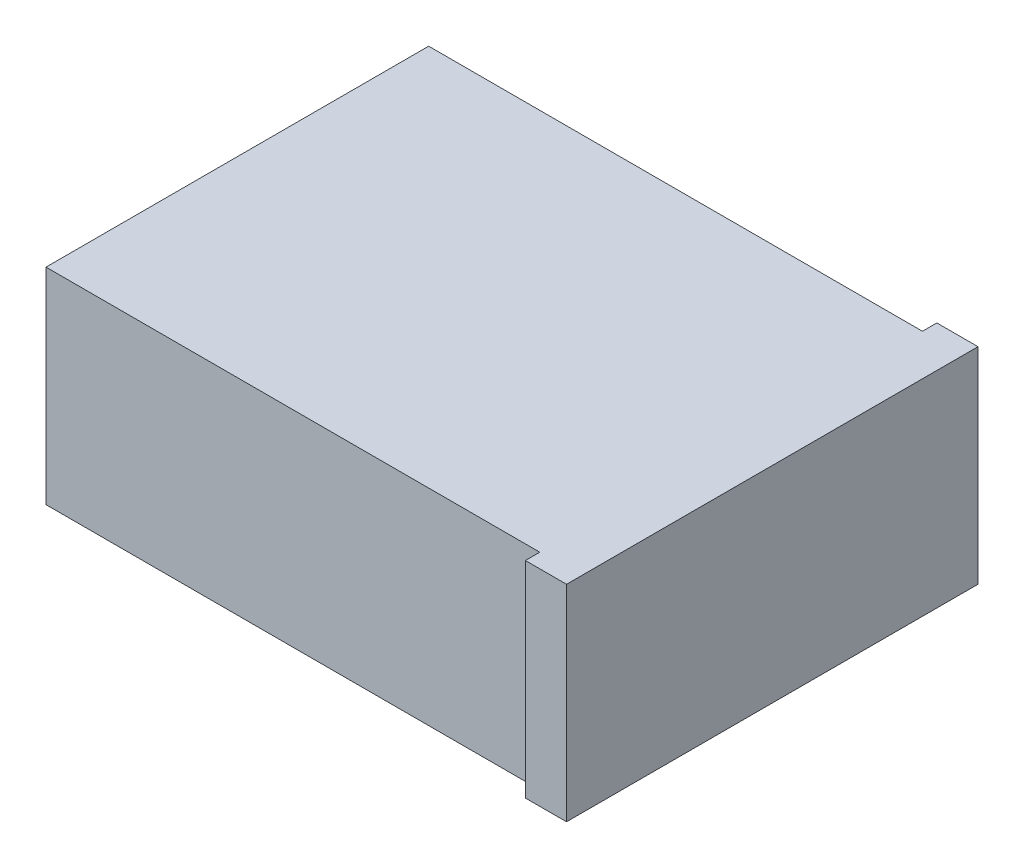
ISO-10303-21;
HEADER;
FILE_DESCRIPTION(('STEP AP214'),'2;1');
FILE_NAME('part.step','',(''),(''),'','','');
FILE_SCHEMA(('AUTOMOTIVE_DESIGN { 1 0 10303 214 1 1 1 1 }'));
ENDSEC;
DATA;
#1=APPLICATION_CONTEXT('core data for automotive mechanical design processes');
#2=APPLICATION_PROTOCOL_DEFINITION('international standard','automotive_design',2000,#1);
#3=PRODUCT_CONTEXT('',#1,'mechanical');
#4=PRODUCT('Part','Part','',(#3));
#5=PRODUCT_RELATED_PRODUCT_CATEGORY('part','',(#4));
#6=PRODUCT_DEFINITION_FORMATION('','',#4);
#7=PRODUCT_DEFINITION_CONTEXT('part definition',#1,'design');
#8=PRODUCT_DEFINITION('design','',#6,#7);
#9=PRODUCT_DEFINITION_SHAPE('','',#8);
#10=(LENGTH_UNIT() NAMED_UNIT(*) SI_UNIT(.MILLI.,.METRE.));
#11=(NAMED_UNIT(*) PLANE_ANGLE_UNIT() SI_UNIT($,.RADIAN.));
#12=(NAMED_UNIT(*) SI_UNIT($,.STERADIAN.) SOLID_ANGLE_UNIT());
#13=UNCERTAINTY_MEASURE_WITH_UNIT(LENGTH_MEASURE(1.E-05),#10,'distance_accuracy_value','');
#14=(GEOMETRIC_REPRESENTATION_CONTEXT(3) GLOBAL_UNCERTAINTY_ASSIGNED_CONTEXT((#13)) GLOBAL_UNIT_ASSIGNED_CONTEXT((#10,
#11,#12)) REPRESENTATION_CONTEXT('',''));
#15=CARTESIAN_POINT('',(0.,0.,0.));
#16=DIRECTION('',(0.,0.,1.));
#17=DIRECTION('',(1.,0.,0.));
#18=AXIS2_PLACEMENT_3D('',#15,#16,#17);
#19=CARTESIAN_POINT('',(55.,50.,0.));
#20=DIRECTION('',(-1.,0.,0.));
#21=DIRECTION('',(0.,0.,1.));
#22=AXIS2_PLACEMENT_3D('',#19,#20,#21);
#23=PLANE('',#22);
#24=DIRECTION('',(0.,0.,-1.));
#25=VECTOR('',#24,1.);
#26=CARTESIAN_POINT('',(55.,0.,0.));
#27=LINE('',#26,#25);
#28=CARTESIAN_POINT('',(55.,0.,-46.5));
#29=VERTEX_POINT('',#28);
#30=CARTESIAN_POINT('',(55.,0.,-50.));
#31=VERTEX_POINT('',#30);
#32=EDGE_CURVE('E127',#29,#31,#27,.T.);
#33=ORIENTED_EDGE('',*,*,#32,.F.);
#34=DIRECTION('',(0.,-1.,0.));
#35=VECTOR('',#34,1.);
#36=CARTESIAN_POINT('',(55.,50.,-46.5));
#37=LINE('',#36,#35);
#38=CARTESIAN_POINT('',(55.,50.,-46.5));
#39=VERTEX_POINT('',#38);
#40=EDGE_CURVE('E11',#39,#29,#37,.T.);
#41=ORIENTED_EDGE('',*,*,#40,.F.);
#42=DIRECTION('',(0.,0.,-1.));
#43=VECTOR('',#42,1.);
#44=CARTESIAN_POINT('',(55.,50.,0.));
#45=LINE('',#44,#43);
#46=CARTESIAN_POINT('',(55.,50.,-50.));
#47=VERTEX_POINT('',#46);
#48=EDGE_CURVE('E146',#39,#47,#45,.T.);
#49=ORIENTED_EDGE('',*,*,#48,.T.);
#50=DIRECTION('',(0.,-1.,0.));
#51=VECTOR('',#50,1.);
#52=CARTESIAN_POINT('',(55.,50.,-50.));
#53=LINE('',#52,#51);
#54=EDGE_CURVE('E51',#47,#31,#53,.T.);
#55=ORIENTED_EDGE('',*,*,#54,.T.);
#56=EDGE_LOOP('',(#33,#41,#49,#55));
#57=FACE_BOUND('',#56,.T.);
#58=ADVANCED_FACE('F35',(#57),#23,.T.);
#59=CARTESIAN_POINT('',(0.,50.,-46.5));
#60=DIRECTION('',(0.,0.,-1.));
#61=DIRECTION('',(-1.,0.,0.));
#62=AXIS2_PLACEMENT_3D('',#59,#60,#61);
#63=PLANE('',#62);
#64=DIRECTION('',(1.,0.,0.));
#65=VECTOR('',#64,1.);
#66=CARTESIAN_POINT('',(0.,0.,-46.5));
#67=LINE('',#66,#65);
#68=CARTESIAN_POINT('',(-65.,0.,-46.5));
#69=VERTEX_POINT('',#68);
#70=EDGE_CURVE('E129',#69,#29,#67,.T.);
#71=ORIENTED_EDGE('',*,*,#70,.F.);
#72=DIRECTION('',(0.,-1.,0.));
#73=VECTOR('',#72,1.);
#74=CARTESIAN_POINT('',(-65.,50.,-46.5));
#75=LINE('',#74,#73);
#76=CARTESIAN_POINT('',(-65.,50.,-46.5));
#77=VERTEX_POINT('',#76);
#78=EDGE_CURVE('E43',#77,#69,#75,.T.);
#79=ORIENTED_EDGE('',*,*,#78,.F.);
#80=DIRECTION('',(1.,0.,0.));
#81=VECTOR('',#80,1.);
#82=CARTESIAN_POINT('',(0.,50.,-46.5));
#83=LINE('',#82,#81);
#84=EDGE_CURVE('E168',#77,#39,#83,.T.);
#85=ORIENTED_EDGE('',*,*,#84,.T.);
#86=ORIENTED_EDGE('',*,*,#40,.T.);
#87=EDGE_LOOP('',(#71,#79,#85,#86));
#88=FACE_BOUND('',#87,.T.);
#89=ADVANCED_FACE('F167',(#88),#63,.T.);
#90=CARTESIAN_POINT('',(-65.,50.,0.));
#91=DIRECTION('',(1.,0.,0.));
#92=DIRECTION('',(0.,0.,-1.));
#93=AXIS2_PLACEMENT_3D('',#90,#91,#92);
#94=PLANE('',#93);
#95=DIRECTION('',(0.,0.,1.));
#96=VECTOR('',#95,1.);
#97=CARTESIAN_POINT('',(-65.,0.,0.));
#98=LINE('',#97,#96);
#99=CARTESIAN_POINT('',(-65.,0.,46.5));
#100=VERTEX_POINT('',#99);
#101=EDGE_CURVE('E132',#69,#100,#98,.T.);
#102=ORIENTED_EDGE('',*,*,#101,.T.);
#103=DIRECTION('',(0.,-1.,0.));
#104=VECTOR('',#103,1.);
#105=CARTESIAN_POINT('',(-65.,50.,46.5));
#106=LINE('',#105,#104);
#107=CARTESIAN_POINT('',(-65.,50.,46.5));
#108=VERTEX_POINT('',#107);
#109=EDGE_CURVE('E152',#108,#100,#106,.T.);
#110=ORIENTED_EDGE('',*,*,#109,.F.);
#111=DIRECTION('',(0.,0.,1.));
#112=VECTOR('',#111,1.);
#113=CARTESIAN_POINT('',(-65.,50.,0.));
#114=LINE('',#113,#112);
#115=EDGE_CURVE('E159',#77,#108,#114,.T.);
#116=ORIENTED_EDGE('',*,*,#115,.F.);
#117=ORIENTED_EDGE('',*,*,#78,.T.);
#118=EDGE_LOOP('',(#102,#110,#116,#117));
#119=FACE_BOUND('',#118,.T.);
#120=ADVANCED_FACE('F157',(#119),#94,.F.);
#121=CARTESIAN_POINT('',(0.,50.,46.5));
#122=DIRECTION('',(0.,0.,-1.));
#123=DIRECTION('',(-1.,0.,0.));
#124=AXIS2_PLACEMENT_3D('',#121,#122,#123);
#125=PLANE('',#124);
#126=DIRECTION('',(1.,0.,0.));
#127=VECTOR('',#126,1.);
#128=CARTESIAN_POINT('',(0.,0.,46.5));
#129=LINE('',#128,#127);
#130=CARTESIAN_POINT('',(55.,0.,46.5));
#131=VERTEX_POINT('',#130);
#132=EDGE_CURVE('E134',#100,#131,#129,.T.);
#133=ORIENTED_EDGE('',*,*,#132,.T.);
#134=DIRECTION('',(0.,-1.,0.));
#135=VECTOR('',#134,1.);
#136=CARTESIAN_POINT('',(55.,50.,46.5));
#137=LINE('',#136,#135);
#138=CARTESIAN_POINT('',(55.,50.,46.5));
#139=VERTEX_POINT('',#138);
#140=EDGE_CURVE('E150',#139,#131,#137,.T.);
#141=ORIENTED_EDGE('',*,*,#140,.F.);
#142=DIRECTION('',(1.,0.,0.));
#143=VECTOR('',#142,1.);
#144=CARTESIAN_POINT('',(0.,50.,46.5));
#145=LINE('',#144,#143);
#146=EDGE_CURVE('E258',#108,#139,#145,.T.);
#147=ORIENTED_EDGE('',*,*,#146,.F.);
#148=ORIENTED_EDGE('',*,*,#109,.T.);
#149=EDGE_LOOP('',(#133,#141,#147,#148));
#150=FACE_BOUND('',#149,.T.);
#151=ADVANCED_FACE('F186',(#150),#125,.F.);
#152=CARTESIAN_POINT('',(55.,50.,0.));
#153=DIRECTION('',(-1.,0.,0.));
#154=DIRECTION('',(0.,0.,1.));
#155=AXIS2_PLACEMENT_3D('',#152,#153,#154);
#156=PLANE('',#155);
#157=DIRECTION('',(0.,0.,-1.));
#158=VECTOR('',#157,1.);
#159=CARTESIAN_POINT('',(55.,0.,0.));
#160=LINE('',#159,#158);
#161=CARTESIAN_POINT('',(55.,0.,50.));
#162=VERTEX_POINT('',#161);
#163=EDGE_CURVE('E137',#162,#131,#160,.T.);
#164=ORIENTED_EDGE('',*,*,#163,.F.);
#165=DIRECTION('',(0.,-1.,0.));
#166=VECTOR('',#165,1.);
#167=CARTESIAN_POINT('',(55.,50.,50.));
#168=LINE('',#167,#166);
#169=CARTESIAN_POINT('',(55.,50.,50.));
#170=VERTEX_POINT('',#169);
#171=EDGE_CURVE('E119',#170,#162,#168,.T.);
#172=ORIENTED_EDGE('',*,*,#171,.F.);
#173=DIRECTION('',(0.,0.,-1.));
#174=VECTOR('',#173,1.);
#175=CARTESIAN_POINT('',(55.,50.,0.));
#176=LINE('',#175,#174);
#177=EDGE_CURVE('E109',#170,#139,#176,.T.);
#178=ORIENTED_EDGE('',*,*,#177,.T.);
#179=ORIENTED_EDGE('',*,*,#140,.T.);
#180=EDGE_LOOP('',(#164,#172,#178,#179));
#181=FACE_BOUND('',#180,.T.);
#182=ADVANCED_FACE('F191',(#181),#156,.T.);
#183=CARTESIAN_POINT('',(0.,50.,50.));
#184=DIRECTION('',(0.,0.,-1.));
#185=DIRECTION('',(-1.,0.,0.));
#186=AXIS2_PLACEMENT_3D('',#183,#184,#185);
#187=PLANE('',#186);
#188=DIRECTION('',(1.,0.,0.));
#189=VECTOR('',#188,1.);
#190=CARTESIAN_POINT('',(0.,0.,50.));
#191=LINE('',#190,#189);
#192=CARTESIAN_POINT('',(65.,0.,50.));
#193=VERTEX_POINT('',#192);
#194=EDGE_CURVE('E116',#162,#193,#191,.T.);
#195=ORIENTED_EDGE('',*,*,#194,.T.);
#196=DIRECTION('',(0.,-1.,0.));
#197=VECTOR('',#196,1.);
#198=CARTESIAN_POINT('',(65.,50.,50.));
#199=LINE('',#198,#197);
#200=CARTESIAN_POINT('',(65.,50.,50.));
#201=VERTEX_POINT('',#200);
#202=EDGE_CURVE('E113',#201,#193,#199,.T.);
#203=ORIENTED_EDGE('',*,*,#202,.F.);
#204=DIRECTION('',(1.,0.,0.));
#205=VECTOR('',#204,1.);
#206=CARTESIAN_POINT('',(0.,50.,50.));
#207=LINE('',#206,#205);
#208=EDGE_CURVE('E102',#170,#201,#207,.T.);
#209=ORIENTED_EDGE('',*,*,#208,.F.);
#210=ORIENTED_EDGE('',*,*,#171,.T.);
#211=EDGE_LOOP('',(#195,#203,#209,#210));
#212=FACE_BOUND('',#211,.T.);
#213=ADVANCED_FACE('F114',(#212),#187,.F.);
#214=CARTESIAN_POINT('',(65.,50.,0.));
#215=DIRECTION('',(1.,0.,0.));
#216=DIRECTION('',(0.,0.,-1.));
#217=AXIS2_PLACEMENT_3D('',#214,#215,#216);
#218=PLANE('',#217);
#219=DIRECTION('',(0.,0.,1.));
#220=VECTOR('',#219,1.);
#221=CARTESIAN_POINT('',(65.,0.,0.));
#222=LINE('',#221,#220);
#223=CARTESIAN_POINT('',(65.,0.,-50.));
#224=VERTEX_POINT('',#223);
#225=EDGE_CURVE('E141',#224,#193,#222,.T.);
#226=ORIENTED_EDGE('',*,*,#225,.F.);
#227=DIRECTION('',(0.,-1.,0.));
#228=VECTOR('',#227,1.);
#229=CARTESIAN_POINT('',(65.,50.,-50.));
#230=LINE('',#229,#228);
#231=CARTESIAN_POINT('',(65.,50.,-50.));
#232=VERTEX_POINT('',#231);
#233=EDGE_CURVE('E76',#232,#224,#230,.T.);
#234=ORIENTED_EDGE('',*,*,#233,.F.);
#235=DIRECTION('',(0.,0.,1.));
#236=VECTOR('',#235,1.);
#237=CARTESIAN_POINT('',(65.,50.,0.));
#238=LINE('',#237,#236);
#239=EDGE_CURVE('E107',#232,#201,#238,.T.);
#240=ORIENTED_EDGE('',*,*,#239,.T.);
#241=ORIENTED_EDGE('',*,*,#202,.T.);
#242=EDGE_LOOP('',(#226,#234,#240,#241));
#243=FACE_BOUND('',#242,.T.);
#244=ADVANCED_FACE('F121',(#243),#218,.T.);
#245=CARTESIAN_POINT('',(0.,50.,-50.));
#246=DIRECTION('',(0.,0.,-1.));
#247=DIRECTION('',(-1.,0.,0.));
#248=AXIS2_PLACEMENT_3D('',#245,#246,#247);
#249=PLANE('',#248);
#250=DIRECTION('',(1.,0.,0.));
#251=VECTOR('',#250,1.);
#252=CARTESIAN_POINT('',(0.,0.,-50.));
#253=LINE('',#252,#251);
#254=EDGE_CURVE('E143',#31,#224,#253,.T.);
#255=ORIENTED_EDGE('',*,*,#254,.F.);
#256=ORIENTED_EDGE('',*,*,#54,.F.);
#257=DIRECTION('',(1.,0.,0.));
#258=VECTOR('',#257,1.);
#259=CARTESIAN_POINT('',(0.,50.,-50.));
#260=LINE('',#259,#258);
#261=EDGE_CURVE('E122',#47,#232,#260,.T.);
#262=ORIENTED_EDGE('',*,*,#261,.T.);
#263=ORIENTED_EDGE('',*,*,#233,.T.);
#264=EDGE_LOOP('',(#255,#256,#262,#263));
#265=FACE_BOUND('',#264,.T.);
#266=ADVANCED_FACE('F169',(#265),#249,.T.);
#267=CARTESIAN_POINT('',(0.,50.,0.));
#268=DIRECTION('',(0.,1.,0.));
#269=DIRECTION('',(0.,0.,1.));
#270=AXIS2_PLACEMENT_3D('',#267,#268,#269);
#271=PLANE('',#270);
#272=ORIENTED_EDGE('',*,*,#48,.F.);
#273=ORIENTED_EDGE('',*,*,#84,.F.);
#274=ORIENTED_EDGE('',*,*,#115,.T.);
#275=ORIENTED_EDGE('',*,*,#146,.T.);
#276=ORIENTED_EDGE('',*,*,#177,.F.);
#277=ORIENTED_EDGE('',*,*,#208,.T.);
#278=ORIENTED_EDGE('',*,*,#239,.F.);
#279=ORIENTED_EDGE('',*,*,#261,.F.);
#280=EDGE_LOOP('',(#272,#273,#274,#275,#276,#277,#278,#279));
#281=FACE_BOUND('',#280,.T.);
#282=ADVANCED_FACE('F104',(#281),#271,.T.);
#283=CARTESIAN_POINT('',(0.,0.,0.));
#284=DIRECTION('',(0.,1.,0.));
#285=DIRECTION('',(0.,0.,1.));
#286=AXIS2_PLACEMENT_3D('',#283,#284,#285);
#287=PLANE('',#286);
#288=ORIENTED_EDGE('',*,*,#32,.T.);
#289=ORIENTED_EDGE('',*,*,#254,.T.);
#290=ORIENTED_EDGE('',*,*,#225,.T.);
#291=ORIENTED_EDGE('',*,*,#194,.F.);
#292=ORIENTED_EDGE('',*,*,#163,.T.);
#293=ORIENTED_EDGE('',*,*,#132,.F.);
#294=ORIENTED_EDGE('',*,*,#101,.F.);
#295=ORIENTED_EDGE('',*,*,#70,.T.);
#296=EDGE_LOOP('',(#288,#289,#290,#291,#292,#293,#294,#295));
#297=FACE_BOUND('',#296,.T.);
#298=ADVANCED_FACE('F166',(#297),#287,.F.);
#299=CLOSED_SHELL('',(#58,#89,#120,#151,#182,#213,#244,#266,#282,#298));
#300=MANIFOLD_SOLID_BREP('B2',#299);
#301=ADVANCED_BREP_SHAPE_REPRESENTATION('',(#18,#300),#14);
#302=SHAPE_DEFINITION_REPRESENTATION(#9,#301);
ENDSEC;
END-ISO-10303-21;
